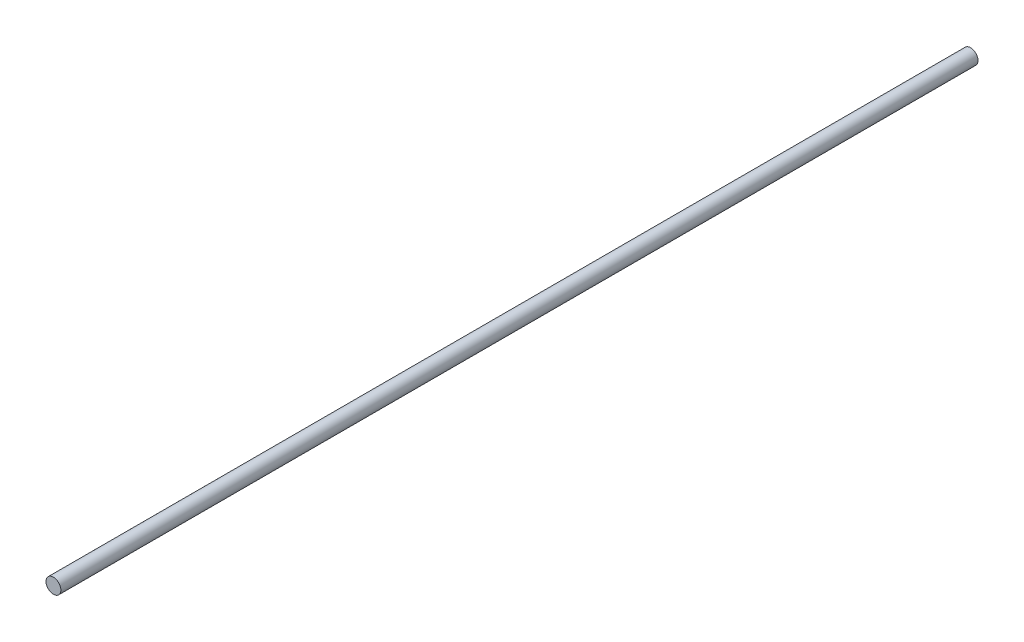
ISO-10303-21;
HEADER;
FILE_DESCRIPTION(('STEP AP214'),'2;1');
FILE_NAME('part.step','',(''),(''),'','','');
FILE_SCHEMA(('AUTOMOTIVE_DESIGN { 1 0 10303 214 1 1 1 1 }'));
ENDSEC;
DATA;
#1=APPLICATION_CONTEXT('core data for automotive mechanical design processes');
#2=APPLICATION_PROTOCOL_DEFINITION('international standard','automotive_design',2000,#1);
#3=PRODUCT_CONTEXT('',#1,'mechanical');
#4=PRODUCT('Part','Part','',(#3));
#5=PRODUCT_RELATED_PRODUCT_CATEGORY('part','',(#4));
#6=PRODUCT_DEFINITION_FORMATION('','',#4);
#7=PRODUCT_DEFINITION_CONTEXT('part definition',#1,'design');
#8=PRODUCT_DEFINITION('design','',#6,#7);
#9=PRODUCT_DEFINITION_SHAPE('','',#8);
#10=(LENGTH_UNIT() NAMED_UNIT(*) SI_UNIT(.MILLI.,.METRE.));
#11=(NAMED_UNIT(*) PLANE_ANGLE_UNIT() SI_UNIT($,.RADIAN.));
#12=(NAMED_UNIT(*) SI_UNIT($,.STERADIAN.) SOLID_ANGLE_UNIT());
#13=UNCERTAINTY_MEASURE_WITH_UNIT(LENGTH_MEASURE(1.E-05),#10,'distance_accuracy_value','');
#14=(GEOMETRIC_REPRESENTATION_CONTEXT(3) GLOBAL_UNCERTAINTY_ASSIGNED_CONTEXT((#13)) GLOBAL_UNIT_ASSIGNED_CONTEXT((#10,
#11,#12)) REPRESENTATION_CONTEXT('',''));
#15=CARTESIAN_POINT('',(0.,0.,0.));
#16=DIRECTION('',(0.,0.,1.));
#17=DIRECTION('',(1.,0.,0.));
#18=AXIS2_PLACEMENT_3D('',#15,#16,#17);
#19=CARTESIAN_POINT('',(-32.4094773450322,8.43173394342302,370.));
#20=DIRECTION('',(0.,0.,-1.));
#21=DIRECTION('',(-1.,0.,0.));
#22=AXIS2_PLACEMENT_3D('',#19,#20,#21);
#23=CYLINDRICAL_SURFACE('',#22,3.);
#24=CARTESIAN_POINT('',(-32.4094773450322,8.43173394342302,370.));
#25=DIRECTION('',(0.,0.,1.));
#26=DIRECTION('',(1.,0.,0.));
#27=AXIS2_PLACEMENT_3D('',#24,#25,#26);
#28=CIRCLE('',#27,3.);
#29=CARTESIAN_POINT('',(-29.4094773450322,8.43173394342302,370.));
#30=VERTEX_POINT('',#29);
#31=EDGE_CURVE('E10',#30,#30,#28,.T.);
#32=ORIENTED_EDGE('',*,*,#31,.F.);
#33=EDGE_LOOP('',(#32));
#34=FACE_BOUND('',#33,.T.);
#35=CARTESIAN_POINT('',(-32.4094773450322,8.43173394342302,0.));
#36=DIRECTION('',(0.,0.,1.));
#37=DIRECTION('',(1.,0.,0.));
#38=AXIS2_PLACEMENT_3D('',#35,#36,#37);
#39=CIRCLE('',#38,3.);
#40=CARTESIAN_POINT('',(-29.4094773450322,8.43173394342302,0.));
#41=VERTEX_POINT('',#40);
#42=EDGE_CURVE('E38',#41,#41,#39,.T.);
#43=ORIENTED_EDGE('',*,*,#42,.T.);
#44=EDGE_LOOP('',(#43));
#45=FACE_BOUND('',#44,.T.);
#46=ADVANCED_FACE('F35',(#34,#45),#23,.T.);
#47=CARTESIAN_POINT('',(-32.4094773450322,8.43173394342302,370.));
#48=DIRECTION('',(0.,0.,1.));
#49=DIRECTION('',(1.,0.,0.));
#50=AXIS2_PLACEMENT_3D('',#47,#48,#49);
#51=PLANE('',#50);
#52=ORIENTED_EDGE('',*,*,#31,.T.);
#53=EDGE_LOOP('',(#52));
#54=FACE_BOUND('',#53,.T.);
#55=ADVANCED_FACE('F50',(#54),#51,.T.);
#56=CARTESIAN_POINT('',(-32.4094773450322,8.43173394342302,0.));
#57=DIRECTION('',(0.,0.,1.));
#58=DIRECTION('',(1.,0.,0.));
#59=AXIS2_PLACEMENT_3D('',#56,#57,#58);
#60=PLANE('',#59);
#61=ORIENTED_EDGE('',*,*,#42,.F.);
#62=EDGE_LOOP('',(#61));
#63=FACE_BOUND('',#62,.T.);
#64=ADVANCED_FACE('F48',(#63),#60,.F.);
#65=CLOSED_SHELL('',(#46,#55,#64));
#66=MANIFOLD_SOLID_BREP('B2',#65);
#67=ADVANCED_BREP_SHAPE_REPRESENTATION('',(#18,#66),#14);
#68=SHAPE_DEFINITION_REPRESENTATION(#9,#67);
ENDSEC;
END-ISO-10303-21;
